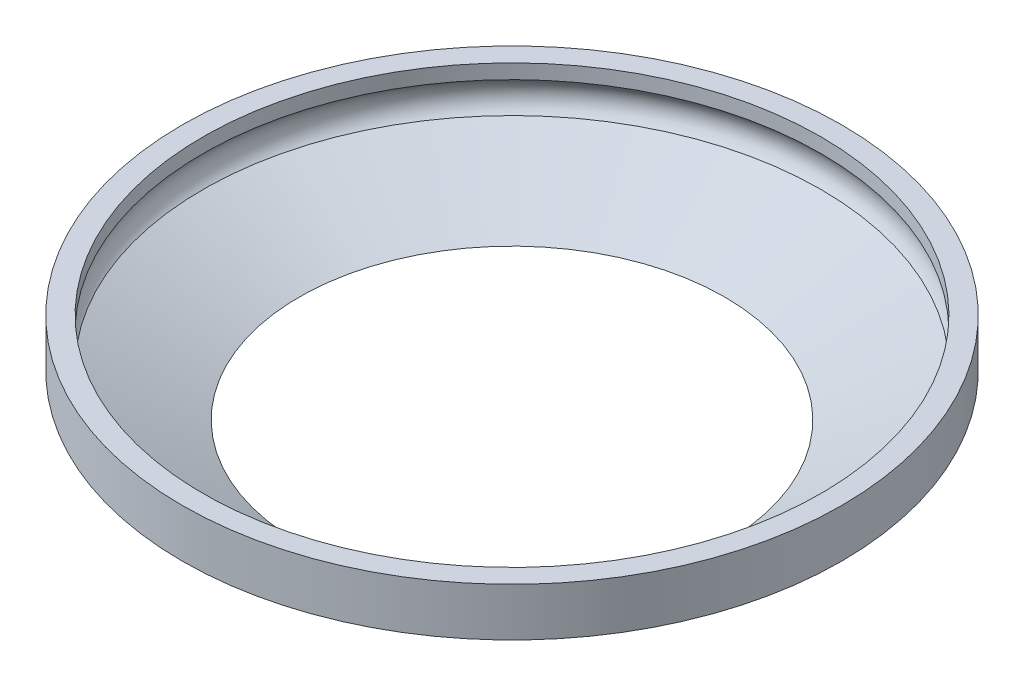
ISO-10303-21;
HEADER;
FILE_DESCRIPTION(('STEP AP214'),'2;1');
FILE_NAME('part.step','',(''),(''),'','','');
FILE_SCHEMA(('AUTOMOTIVE_DESIGN { 1 0 10303 214 1 1 1 1 }'));
ENDSEC;
DATA;
#1=APPLICATION_CONTEXT('core data for automotive mechanical design processes');
#2=APPLICATION_PROTOCOL_DEFINITION('international standard','automotive_design',2000,#1);
#3=PRODUCT_CONTEXT('',#1,'mechanical');
#4=PRODUCT('Part','Part','',(#3));
#5=PRODUCT_RELATED_PRODUCT_CATEGORY('part','',(#4));
#6=PRODUCT_DEFINITION_FORMATION('','',#4);
#7=PRODUCT_DEFINITION_CONTEXT('part definition',#1,'design');
#8=PRODUCT_DEFINITION('design','',#6,#7);
#9=PRODUCT_DEFINITION_SHAPE('','',#8);
#10=(LENGTH_UNIT() NAMED_UNIT(*) SI_UNIT(.MILLI.,.METRE.));
#11=(NAMED_UNIT(*) PLANE_ANGLE_UNIT() SI_UNIT($,.RADIAN.));
#12=(NAMED_UNIT(*) SI_UNIT($,.STERADIAN.) SOLID_ANGLE_UNIT());
#13=UNCERTAINTY_MEASURE_WITH_UNIT(LENGTH_MEASURE(1.E-05),#10,'distance_accuracy_value','');
#14=(GEOMETRIC_REPRESENTATION_CONTEXT(3) GLOBAL_UNCERTAINTY_ASSIGNED_CONTEXT((#13)) GLOBAL_UNIT_ASSIGNED_CONTEXT((#10,
#11,#12)) REPRESENTATION_CONTEXT('',''));
#15=CARTESIAN_POINT('',(0.,0.,0.));
#16=DIRECTION('',(0.,0.,1.));
#17=DIRECTION('',(1.,0.,0.));
#18=AXIS2_PLACEMENT_3D('',#15,#16,#17);
#19=CARTESIAN_POINT('',(0.,0.,0.));
#20=DIRECTION('',(0.,-1.,0.));
#21=DIRECTION('',(0.,0.,-1.));
#22=AXIS2_PLACEMENT_3D('',#19,#20,#21);
#23=CYLINDRICAL_SURFACE('',#22,29.8);
#24=CARTESIAN_POINT('',(0.,-0.600000000000004,0.));
#25=DIRECTION('',(0.,-1.,0.));
#26=DIRECTION('',(0.,0.,-1.));
#27=AXIS2_PLACEMENT_3D('',#24,#25,#26);
#28=CIRCLE('',#27,29.8);
#29=CARTESIAN_POINT('',(0.,-0.600000000000004,-29.8));
#30=VERTEX_POINT('',#29);
#31=EDGE_CURVE('E10',#30,#30,#28,.T.);
#32=ORIENTED_EDGE('',*,*,#31,.T.);
#33=EDGE_LOOP('',(#32));
#34=FACE_BOUND('',#33,.T.);
#35=CARTESIAN_POINT('',(0.,0.799999999999997,0.));
#36=DIRECTION('',(0.,-1.,0.));
#37=DIRECTION('',(0.,0.,-1.));
#38=AXIS2_PLACEMENT_3D('',#35,#36,#37);
#39=CIRCLE('',#38,29.8);
#40=CARTESIAN_POINT('',(0.,0.799999999999997,-29.8));
#41=VERTEX_POINT('',#40);
#42=EDGE_CURVE('E52',#41,#41,#39,.T.);
#43=ORIENTED_EDGE('',*,*,#42,.F.);
#44=EDGE_LOOP('',(#43));
#45=FACE_BOUND('',#44,.T.);
#46=ADVANCED_FACE('F32',(#34,#45),#23,.F.);
#47=CARTESIAN_POINT('',(0.,0.,0.));
#48=DIRECTION('',(0.,-1.,0.));
#49=DIRECTION('',(0.,0.,-1.));
#50=AXIS2_PLACEMENT_3D('',#47,#48,#49);
#51=CYLINDRICAL_SURFACE('',#50,31.8);
#52=CARTESIAN_POINT('',(0.,-3.85332766723155,0.));
#53=DIRECTION('',(0.,-1.,0.));
#54=DIRECTION('',(0.,0.,-1.));
#55=AXIS2_PLACEMENT_3D('',#52,#53,#54);
#56=CIRCLE('',#55,31.8);
#57=CARTESIAN_POINT('',(0.,-3.85332766723155,-31.8));
#58=VERTEX_POINT('',#57);
#59=EDGE_CURVE('E40',#58,#58,#56,.T.);
#60=ORIENTED_EDGE('',*,*,#59,.F.);
#61=EDGE_LOOP('',(#60));
#62=FACE_BOUND('',#61,.T.);
#63=CARTESIAN_POINT('',(0.,0.799999999999997,0.));
#64=DIRECTION('',(0.,-1.,0.));
#65=DIRECTION('',(0.,0.,-1.));
#66=AXIS2_PLACEMENT_3D('',#63,#64,#65);
#67=CIRCLE('',#66,31.8);
#68=CARTESIAN_POINT('',(0.,0.799999999999997,-31.8));
#69=VERTEX_POINT('',#68);
#70=EDGE_CURVE('E49',#69,#69,#67,.T.);
#71=ORIENTED_EDGE('',*,*,#70,.T.);
#72=EDGE_LOOP('',(#71));
#73=FACE_BOUND('',#72,.T.);
#74=ADVANCED_FACE('F81',(#62,#73),#51,.T.);
#75=CARTESIAN_POINT('',(0.,-3.85332766723155,0.));
#76=DIRECTION('',(0.,1.,0.));
#77=DIRECTION('',(0.,0.,1.));
#78=AXIS2_PLACEMENT_3D('',#75,#76,#77);
#79=CONICAL_SURFACE('',#78,31.8,1.15026918033059);
#80=ORIENTED_EDGE('',*,*,#59,.T.);
#81=EDGE_LOOP('',(#80));
#82=FACE_BOUND('',#81,.T.);
#83=CARTESIAN_POINT('',(0.,-7.96335525708464,0.));
#84=DIRECTION('',(0.,-1.,0.));
#85=DIRECTION('',(0.,0.,-1.));
#86=AXIS2_PLACEMENT_3D('',#83,#84,#85);
#87=CIRCLE('',#86,22.6095216393563);
#88=CARTESIAN_POINT('',(0.,-7.96335525708464,-22.6095216393563));
#89=VERTEX_POINT('',#88);
#90=EDGE_CURVE('E36',#89,#89,#87,.T.);
#91=ORIENTED_EDGE('',*,*,#90,.F.);
#92=EDGE_LOOP('',(#91));
#93=FACE_BOUND('',#92,.T.);
#94=ADVANCED_FACE('F85',(#82,#93),#79,.T.);
#95=CARTESIAN_POINT('',(0.,-2.1,0.));
#96=DIRECTION('',(0.,-1.,0.));
#97=DIRECTION('',(0.,0.,-1.));
#98=AXIS2_PLACEMENT_3D('',#95,#96,#97);
#99=TOROIDAL_SURFACE('',#98,28.5428571428571,1.95714285714286);
#100=ORIENTED_EDGE('',*,*,#31,.F.);
#101=EDGE_LOOP('',(#100));
#102=FACE_BOUND('',#101,.T.);
#103=CARTESIAN_POINT('',(0.,-3.6,0.));
#104=DIRECTION('',(0.,-1.,0.));
#105=DIRECTION('',(0.,0.,-1.));
#106=AXIS2_PLACEMENT_3D('',#103,#104,#105);
#107=CIRCLE('',#106,29.8);
#108=CARTESIAN_POINT('',(0.,-3.6,-29.8));
#109=VERTEX_POINT('',#108);
#110=EDGE_CURVE('E55',#109,#109,#107,.T.);
#111=ORIENTED_EDGE('',*,*,#110,.T.);
#112=EDGE_LOOP('',(#111));
#113=FACE_BOUND('',#112,.T.);
#114=ADVANCED_FACE('F34',(#102,#113),#99,.F.);
#115=CARTESIAN_POINT('',(0.,-9.31390427104036,0.));
#116=DIRECTION('',(0.,1.,0.));
#117=DIRECTION('',(0.,0.,1.));
#118=AXIS2_PLACEMENT_3D('',#115,#116,#117);
#119=CONICAL_SURFACE('',#118,21.,0.872664625997166);
#120=CARTESIAN_POINT('',(0.,-7.94390427104036,0.));
#121=DIRECTION('',(0.,1.,0.));
#122=DIRECTION('',(0.,0.,1.));
#123=AXIS2_PLACEMENT_3D('',#120,#121,#122);
#124=CIRCLE('',#123,22.6327024218541);
#125=CARTESIAN_POINT('',(0.,-7.94390427104036,22.6327024218541));
#126=VERTEX_POINT('',#125);
#127=EDGE_CURVE('E46',#126,#126,#124,.T.);
#128=ORIENTED_EDGE('',*,*,#127,.T.);
#129=EDGE_LOOP('',(#128));
#130=FACE_BOUND('',#129,.T.);
#131=ORIENTED_EDGE('',*,*,#90,.T.);
#132=EDGE_LOOP('',(#131));
#133=FACE_BOUND('',#132,.T.);
#134=ADVANCED_FACE('F68',(#130,#133),#119,.F.);
#135=CARTESIAN_POINT('',(0.,-7.94390427104036,0.));
#136=DIRECTION('',(0.,1.,0.));
#137=DIRECTION('',(0.,0.,1.));
#138=AXIS2_PLACEMENT_3D('',#135,#136,#137);
#139=PLANE('',#138);
#140=ORIENTED_EDGE('',*,*,#127,.F.);
#141=EDGE_LOOP('',(#140));
#142=FACE_BOUND('',#141,.T.);
#143=CARTESIAN_POINT('',(0.,-7.94390427104036,0.));
#144=DIRECTION('',(0.,-1.,0.));
#145=DIRECTION('',(0.,0.,-1.));
#146=AXIS2_PLACEMENT_3D('',#143,#144,#145);
#147=CIRCLE('',#146,20.5171481498164);
#148=CARTESIAN_POINT('',(0.,-7.94390427104036,-20.5171481498164));
#149=VERTEX_POINT('',#148);
#150=EDGE_CURVE('E58',#149,#149,#147,.T.);
#151=ORIENTED_EDGE('',*,*,#150,.F.);
#152=EDGE_LOOP('',(#151));
#153=FACE_BOUND('',#152,.T.);
#154=ADVANCED_FACE('F65',(#142,#153),#139,.F.);
#155=CARTESIAN_POINT('',(-31.8,0.799999999999997,0.));
#156=DIRECTION('',(0.,1.,0.));
#157=DIRECTION('',(0.,0.,1.));
#158=AXIS2_PLACEMENT_3D('',#155,#156,#157);
#159=PLANE('',#158);
#160=ORIENTED_EDGE('',*,*,#42,.T.);
#161=EDGE_LOOP('',(#160));
#162=FACE_BOUND('',#161,.T.);
#163=ORIENTED_EDGE('',*,*,#70,.F.);
#164=EDGE_LOOP('',(#163));
#165=FACE_BOUND('',#164,.T.);
#166=ADVANCED_FACE('F67',(#162,#165),#159,.T.);
#167=CARTESIAN_POINT('',(0.,-3.6,0.));
#168=DIRECTION('',(0.,1.,0.));
#169=DIRECTION('',(0.,0.,1.));
#170=AXIS2_PLACEMENT_3D('',#167,#168,#169);
#171=CONICAL_SURFACE('',#170,29.8,1.13311640579651);
#172=ORIENTED_EDGE('',*,*,#150,.T.);
#173=EDGE_LOOP('',(#172));
#174=FACE_BOUND('',#173,.T.);
#175=ORIENTED_EDGE('',*,*,#110,.F.);
#176=EDGE_LOOP('',(#175));
#177=FACE_BOUND('',#176,.T.);
#178=ADVANCED_FACE('F62',(#174,#177),#171,.F.);
#179=CLOSED_SHELL('',(#46,#74,#94,#114,#134,#154,#166,#178));
#180=MANIFOLD_SOLID_BREP('B2',#179);
#181=ADVANCED_BREP_SHAPE_REPRESENTATION('',(#18,#180),#14);
#182=SHAPE_DEFINITION_REPRESENTATION(#9,#181);
ENDSEC;
END-ISO-10303-21;
